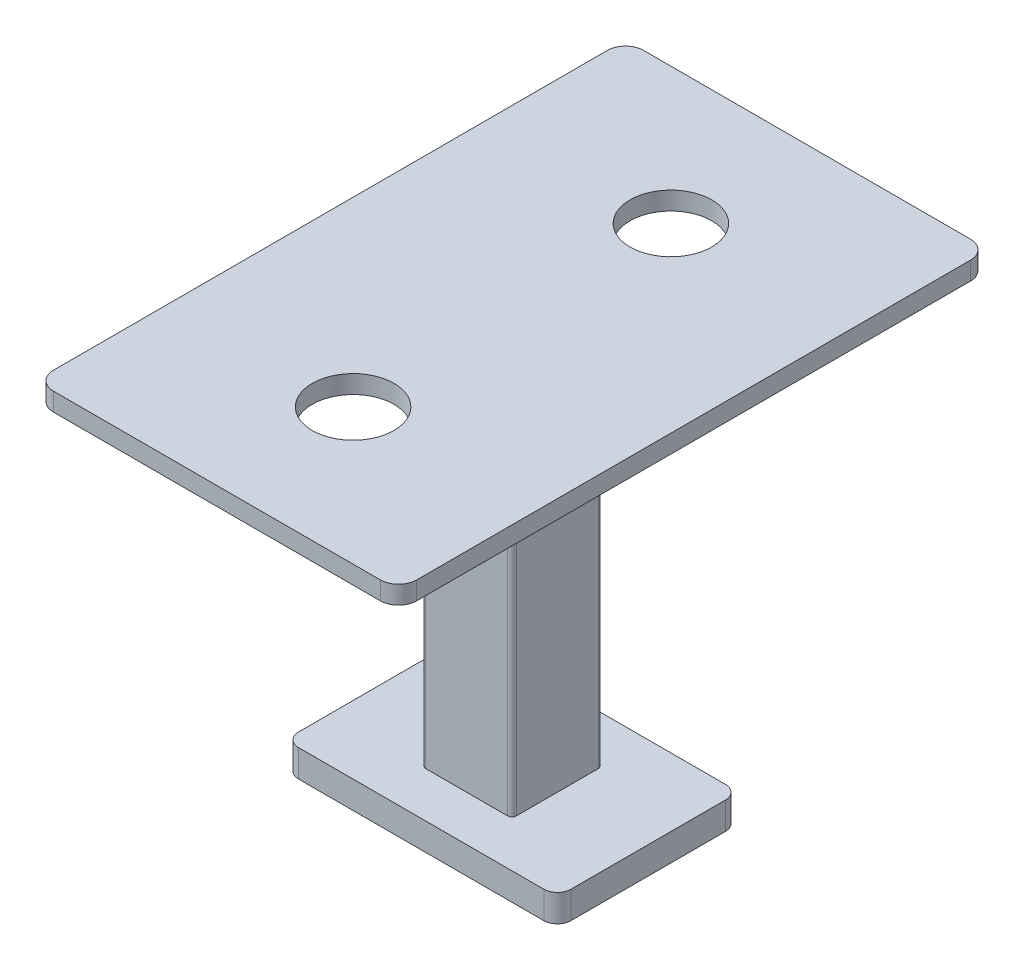
ISO-10303-21;
HEADER;
FILE_DESCRIPTION(('STEP AP214'),'2;1');
FILE_NAME('part.step','',(''),(''),'','','');
FILE_SCHEMA(('AUTOMOTIVE_DESIGN { 1 0 10303 214 1 1 1 1 }'));
ENDSEC;
DATA;
#1=APPLICATION_CONTEXT('core data for automotive mechanical design processes');
#2=APPLICATION_PROTOCOL_DEFINITION('international standard','automotive_design',2000,#1);
#3=PRODUCT_CONTEXT('',#1,'mechanical');
#4=PRODUCT('Part','Part','',(#3));
#5=PRODUCT_RELATED_PRODUCT_CATEGORY('part','',(#4));
#6=PRODUCT_DEFINITION_FORMATION('','',#4);
#7=PRODUCT_DEFINITION_CONTEXT('part definition',#1,'design');
#8=PRODUCT_DEFINITION('design','',#6,#7);
#9=PRODUCT_DEFINITION_SHAPE('','',#8);
#10=(LENGTH_UNIT() NAMED_UNIT(*) SI_UNIT(.MILLI.,.METRE.));
#11=(NAMED_UNIT(*) PLANE_ANGLE_UNIT() SI_UNIT($,.RADIAN.));
#12=(NAMED_UNIT(*) SI_UNIT($,.STERADIAN.) SOLID_ANGLE_UNIT());
#13=UNCERTAINTY_MEASURE_WITH_UNIT(LENGTH_MEASURE(1.E-05),#10,'distance_accuracy_value','');
#14=(GEOMETRIC_REPRESENTATION_CONTEXT(3) GLOBAL_UNCERTAINTY_ASSIGNED_CONTEXT((#13)) GLOBAL_UNIT_ASSIGNED_CONTEXT((#10,
#11,#12)) REPRESENTATION_CONTEXT('',''));
#15=CARTESIAN_POINT('',(0.,0.,0.));
#16=DIRECTION('',(0.,0.,1.));
#17=DIRECTION('',(1.,0.,0.));
#18=AXIS2_PLACEMENT_3D('',#15,#16,#17);
#19=CARTESIAN_POINT('',(28.5,3.,-18.5));
#20=DIRECTION('',(0.,1.,0.));
#21=DIRECTION('',(0.,0.,1.));
#22=AXIS2_PLACEMENT_3D('',#19,#20,#21);
#23=PLANE('',#22);
#24=CARTESIAN_POINT('',(28.5,3.,-18.5));
#25=DIRECTION('',(0.,1.,0.));
#26=DIRECTION('',(0.,0.,1.));
#27=AXIS2_PLACEMENT_3D('',#24,#25,#26);
#28=CIRCLE('',#27,1.5);
#29=CARTESIAN_POINT('',(30.,3.,-18.5));
#30=VERTEX_POINT('',#29);
#31=CARTESIAN_POINT('',(28.5,3.,-20.));
#32=VERTEX_POINT('',#31);
#33=EDGE_CURVE('E169',#30,#32,#28,.T.);
#34=ORIENTED_EDGE('',*,*,#33,.T.);
#35=DIRECTION('',(-1.,0.,0.));
#36=VECTOR('',#35,1.);
#37=CARTESIAN_POINT('',(28.5,3.,-20.));
#38=LINE('',#37,#36);
#39=CARTESIAN_POINT('',(1.50000000000001,3.,-20.));
#40=VERTEX_POINT('',#39);
#41=EDGE_CURVE('E108',#32,#40,#38,.T.);
#42=ORIENTED_EDGE('',*,*,#41,.T.);
#43=CARTESIAN_POINT('',(1.5,3.,-18.5));
#44=DIRECTION('',(0.,1.,0.));
#45=DIRECTION('',(0.,0.,1.));
#46=AXIS2_PLACEMENT_3D('',#43,#44,#45);
#47=CIRCLE('',#46,1.5);
#48=CARTESIAN_POINT('',(0.,3.,-18.5));
#49=VERTEX_POINT('',#48);
#50=EDGE_CURVE('E183',#40,#49,#47,.T.);
#51=ORIENTED_EDGE('',*,*,#50,.T.);
#52=DIRECTION('',(0.,0.,1.));
#53=VECTOR('',#52,1.);
#54=CARTESIAN_POINT('',(0.,3.,-18.5));
#55=LINE('',#54,#53);
#56=CARTESIAN_POINT('',(0.,3.,-1.50000000000001));
#57=VERTEX_POINT('',#56);
#58=EDGE_CURVE('E193',#49,#57,#55,.T.);
#59=ORIENTED_EDGE('',*,*,#58,.T.);
#60=CARTESIAN_POINT('',(1.5,3.,-1.5));
#61=DIRECTION('',(0.,-1.,0.));
#62=DIRECTION('',(0.,0.,-1.));
#63=AXIS2_PLACEMENT_3D('',#60,#61,#62);
#64=CIRCLE('',#63,1.5);
#65=CARTESIAN_POINT('',(1.50000000000001,3.,0.));
#66=VERTEX_POINT('',#65);
#67=EDGE_CURVE('E131',#66,#57,#64,.T.);
#68=ORIENTED_EDGE('',*,*,#67,.F.);
#69=DIRECTION('',(1.,0.,0.));
#70=VECTOR('',#69,1.);
#71=CARTESIAN_POINT('',(1.50000000000001,3.,0.));
#72=LINE('',#71,#70);
#73=CARTESIAN_POINT('',(28.5,3.,0.));
#74=VERTEX_POINT('',#73);
#75=EDGE_CURVE('E125',#66,#74,#72,.T.);
#76=ORIENTED_EDGE('',*,*,#75,.T.);
#77=CARTESIAN_POINT('',(28.5,3.,-1.5));
#78=DIRECTION('',(0.,-1.,0.));
#79=DIRECTION('',(0.,0.,-1.));
#80=AXIS2_PLACEMENT_3D('',#77,#78,#79);
#81=CIRCLE('',#80,1.5);
#82=CARTESIAN_POINT('',(30.,3.,-1.50000000000001));
#83=VERTEX_POINT('',#82);
#84=EDGE_CURVE('E129',#83,#74,#81,.T.);
#85=ORIENTED_EDGE('',*,*,#84,.F.);
#86=DIRECTION('',(0.,0.,-1.));
#87=VECTOR('',#86,1.);
#88=CARTESIAN_POINT('',(30.,3.,-1.50000000000001));
#89=LINE('',#88,#87);
#90=EDGE_CURVE('E67',#83,#30,#89,.T.);
#91=ORIENTED_EDGE('',*,*,#90,.T.);
#92=EDGE_LOOP('',(#34,#42,#51,#59,#68,#76,#85,#91));
#93=FACE_BOUND('',#92,.T.);
#94=DIRECTION('',(-1.,0.,0.));
#95=VECTOR('',#94,1.);
#96=CARTESIAN_POINT('',(10.5,3.,-15.));
#97=LINE('',#96,#95);
#98=CARTESIAN_POINT('',(19.5,3.,-15.));
#99=VERTEX_POINT('',#98);
#100=CARTESIAN_POINT('',(10.5,3.,-15.));
#101=VERTEX_POINT('',#100);
#102=EDGE_CURVE('E238',#99,#101,#97,.T.);
#103=ORIENTED_EDGE('',*,*,#102,.F.);
#104=CARTESIAN_POINT('',(19.5,3.,-14.5));
#105=DIRECTION('',(0.,1.,0.));
#106=DIRECTION('',(0.,0.,1.));
#107=AXIS2_PLACEMENT_3D('',#104,#105,#106);
#108=CIRCLE('',#107,0.5);
#109=CARTESIAN_POINT('',(20.,3.,-14.5));
#110=VERTEX_POINT('',#109);
#111=EDGE_CURVE('E241',#110,#99,#108,.T.);
#112=ORIENTED_EDGE('',*,*,#111,.F.);
#113=DIRECTION('',(0.,0.,-1.));
#114=VECTOR('',#113,1.);
#115=CARTESIAN_POINT('',(20.,3.,-5.50000000000001));
#116=LINE('',#115,#114);
#117=CARTESIAN_POINT('',(20.,3.,-5.50000000000001));
#118=VERTEX_POINT('',#117);
#119=EDGE_CURVE('E221',#118,#110,#116,.T.);
#120=ORIENTED_EDGE('',*,*,#119,.F.);
#121=CARTESIAN_POINT('',(19.5,3.,-5.50000000000001));
#122=DIRECTION('',(0.,1.,0.));
#123=DIRECTION('',(0.,0.,-1.));
#124=AXIS2_PLACEMENT_3D('',#121,#122,#123);
#125=CIRCLE('',#124,0.5);
#126=CARTESIAN_POINT('',(19.5,3.,-5.));
#127=VERTEX_POINT('',#126);
#128=EDGE_CURVE('E224',#127,#118,#125,.T.);
#129=ORIENTED_EDGE('',*,*,#128,.F.);
#130=DIRECTION('',(1.,0.,0.));
#131=VECTOR('',#130,1.);
#132=CARTESIAN_POINT('',(10.5,3.,-5.));
#133=LINE('',#132,#131);
#134=CARTESIAN_POINT('',(10.5,3.,-5.));
#135=VERTEX_POINT('',#134);
#136=EDGE_CURVE('E226',#135,#127,#133,.T.);
#137=ORIENTED_EDGE('',*,*,#136,.F.);
#138=CARTESIAN_POINT('',(10.5,3.,-5.5));
#139=DIRECTION('',(0.,1.,0.));
#140=DIRECTION('',(0.,0.,-1.));
#141=AXIS2_PLACEMENT_3D('',#138,#139,#140);
#142=CIRCLE('',#141,0.5);
#143=CARTESIAN_POINT('',(10.,3.,-5.50000000000001));
#144=VERTEX_POINT('',#143);
#145=EDGE_CURVE('E229',#144,#135,#142,.T.);
#146=ORIENTED_EDGE('',*,*,#145,.F.);
#147=DIRECTION('',(0.,0.,1.));
#148=VECTOR('',#147,1.);
#149=CARTESIAN_POINT('',(10.,3.,-5.50000000000001));
#150=LINE('',#149,#148);
#151=CARTESIAN_POINT('',(10.,3.,-14.5));
#152=VERTEX_POINT('',#151);
#153=EDGE_CURVE('E232',#152,#144,#150,.T.);
#154=ORIENTED_EDGE('',*,*,#153,.F.);
#155=CARTESIAN_POINT('',(10.5,3.,-14.5));
#156=DIRECTION('',(0.,1.,0.));
#157=DIRECTION('',(0.,0.,1.));
#158=AXIS2_PLACEMENT_3D('',#155,#156,#157);
#159=CIRCLE('',#158,0.5);
#160=EDGE_CURVE('E235',#101,#152,#159,.T.);
#161=ORIENTED_EDGE('',*,*,#160,.F.);
#162=EDGE_LOOP('',(#103,#112,#120,#129,#137,#146,#154,#161));
#163=FACE_BOUND('',#162,.T.);
#164=ADVANCED_FACE('F43',(#93,#163),#23,.T.);
#165=CARTESIAN_POINT('',(28.5,3.,-18.5));
#166=DIRECTION('',(0.,-1.,0.));
#167=DIRECTION('',(0.,0.,-1.));
#168=AXIS2_PLACEMENT_3D('',#165,#166,#167);
#169=CYLINDRICAL_SURFACE('',#168,1.5);
#170=CARTESIAN_POINT('',(28.5,0.,-18.5));
#171=DIRECTION('',(0.,1.,0.));
#172=DIRECTION('',(0.,0.,1.));
#173=AXIS2_PLACEMENT_3D('',#170,#171,#172);
#174=CIRCLE('',#173,1.5);
#175=CARTESIAN_POINT('',(30.,0.,-18.5));
#176=VERTEX_POINT('',#175);
#177=CARTESIAN_POINT('',(28.5,0.,-20.));
#178=VERTEX_POINT('',#177);
#179=EDGE_CURVE('E151',#176,#178,#174,.T.);
#180=ORIENTED_EDGE('',*,*,#179,.T.);
#181=DIRECTION('',(0.,-1.,0.));
#182=VECTOR('',#181,1.);
#183=CARTESIAN_POINT('',(28.5,3.,-20.));
#184=LINE('',#183,#182);
#185=EDGE_CURVE('E11',#32,#178,#184,.T.);
#186=ORIENTED_EDGE('',*,*,#185,.F.);
#187=ORIENTED_EDGE('',*,*,#33,.F.);
#188=DIRECTION('',(0.,-1.,0.));
#189=VECTOR('',#188,1.);
#190=CARTESIAN_POINT('',(30.,3.,-18.5));
#191=LINE('',#190,#189);
#192=EDGE_CURVE('E147',#30,#176,#191,.T.);
#193=ORIENTED_EDGE('',*,*,#192,.T.);
#194=EDGE_LOOP('',(#180,#186,#187,#193));
#195=FACE_BOUND('',#194,.T.);
#196=ADVANCED_FACE('F45',(#195),#169,.T.);
#197=CARTESIAN_POINT('',(28.5,3.,-20.));
#198=DIRECTION('',(0.,0.,1.));
#199=DIRECTION('',(1.,0.,0.));
#200=AXIS2_PLACEMENT_3D('',#197,#198,#199);
#201=PLANE('',#200);
#202=DIRECTION('',(-1.,0.,0.));
#203=VECTOR('',#202,1.);
#204=CARTESIAN_POINT('',(28.5,0.,-20.));
#205=LINE('',#204,#203);
#206=CARTESIAN_POINT('',(1.50000000000001,0.,-20.));
#207=VERTEX_POINT('',#206);
#208=EDGE_CURVE('E154',#178,#207,#205,.T.);
#209=ORIENTED_EDGE('',*,*,#208,.T.);
#210=DIRECTION('',(0.,-1.,0.));
#211=VECTOR('',#210,1.);
#212=CARTESIAN_POINT('',(1.50000000000001,3.,-20.));
#213=LINE('',#212,#211);
#214=EDGE_CURVE('E51',#40,#207,#213,.T.);
#215=ORIENTED_EDGE('',*,*,#214,.F.);
#216=ORIENTED_EDGE('',*,*,#41,.F.);
#217=ORIENTED_EDGE('',*,*,#185,.T.);
#218=EDGE_LOOP('',(#209,#215,#216,#217));
#219=FACE_BOUND('',#218,.T.);
#220=ADVANCED_FACE('F477',(#219),#201,.F.);
#221=CARTESIAN_POINT('',(1.5,3.,-18.5));
#222=DIRECTION('',(0.,-1.,0.));
#223=DIRECTION('',(0.,0.,-1.));
#224=AXIS2_PLACEMENT_3D('',#221,#222,#223);
#225=CYLINDRICAL_SURFACE('',#224,1.5);
#226=CARTESIAN_POINT('',(1.5,0.,-18.5));
#227=DIRECTION('',(0.,1.,0.));
#228=DIRECTION('',(0.,0.,1.));
#229=AXIS2_PLACEMENT_3D('',#226,#227,#228);
#230=CIRCLE('',#229,1.5);
#231=CARTESIAN_POINT('',(0.,0.,-18.5));
#232=VERTEX_POINT('',#231);
#233=EDGE_CURVE('E157',#207,#232,#230,.T.);
#234=ORIENTED_EDGE('',*,*,#233,.T.);
#235=DIRECTION('',(0.,-1.,0.));
#236=VECTOR('',#235,1.);
#237=CARTESIAN_POINT('',(0.,3.,-18.5));
#238=LINE('',#237,#236);
#239=EDGE_CURVE('E175',#49,#232,#238,.T.);
#240=ORIENTED_EDGE('',*,*,#239,.F.);
#241=ORIENTED_EDGE('',*,*,#50,.F.);
#242=ORIENTED_EDGE('',*,*,#214,.T.);
#243=EDGE_LOOP('',(#234,#240,#241,#242));
#244=FACE_BOUND('',#243,.T.);
#245=ADVANCED_FACE('F181',(#244),#225,.T.);
#246=CARTESIAN_POINT('',(0.,3.,-18.5));
#247=DIRECTION('',(1.,0.,0.));
#248=DIRECTION('',(0.,0.,-1.));
#249=AXIS2_PLACEMENT_3D('',#246,#247,#248);
#250=PLANE('',#249);
#251=DIRECTION('',(0.,0.,1.));
#252=VECTOR('',#251,1.);
#253=CARTESIAN_POINT('',(0.,0.,-18.5));
#254=LINE('',#253,#252);
#255=CARTESIAN_POINT('',(0.,0.,-1.50000000000001));
#256=VERTEX_POINT('',#255);
#257=EDGE_CURVE('E159',#232,#256,#254,.T.);
#258=ORIENTED_EDGE('',*,*,#257,.T.);
#259=DIRECTION('',(0.,-1.,0.));
#260=VECTOR('',#259,1.);
#261=CARTESIAN_POINT('',(0.,3.,-1.50000000000001));
#262=LINE('',#261,#260);
#263=EDGE_CURVE('E173',#57,#256,#262,.T.);
#264=ORIENTED_EDGE('',*,*,#263,.F.);
#265=ORIENTED_EDGE('',*,*,#58,.F.);
#266=ORIENTED_EDGE('',*,*,#239,.T.);
#267=EDGE_LOOP('',(#258,#264,#265,#266));
#268=FACE_BOUND('',#267,.T.);
#269=ADVANCED_FACE('F191',(#268),#250,.F.);
#270=CARTESIAN_POINT('',(1.5,3.,-1.5));
#271=DIRECTION('',(0.,-1.,0.));
#272=DIRECTION('',(0.,0.,-1.));
#273=AXIS2_PLACEMENT_3D('',#270,#271,#272);
#274=CYLINDRICAL_SURFACE('',#273,1.5);
#275=CARTESIAN_POINT('',(1.5,0.,-1.5));
#276=DIRECTION('',(0.,-1.,0.));
#277=DIRECTION('',(0.,0.,-1.));
#278=AXIS2_PLACEMENT_3D('',#275,#276,#277);
#279=CIRCLE('',#278,1.5);
#280=CARTESIAN_POINT('',(1.50000000000001,0.,0.));
#281=VERTEX_POINT('',#280);
#282=EDGE_CURVE('E162',#281,#256,#279,.T.);
#283=ORIENTED_EDGE('',*,*,#282,.F.);
#284=DIRECTION('',(0.,-1.,0.));
#285=VECTOR('',#284,1.);
#286=CARTESIAN_POINT('',(1.50000000000001,3.,0.));
#287=LINE('',#286,#285);
#288=EDGE_CURVE('E142',#66,#281,#287,.T.);
#289=ORIENTED_EDGE('',*,*,#288,.F.);
#290=ORIENTED_EDGE('',*,*,#67,.T.);
#291=ORIENTED_EDGE('',*,*,#263,.T.);
#292=EDGE_LOOP('',(#283,#289,#290,#291));
#293=FACE_BOUND('',#292,.T.);
#294=ADVANCED_FACE('F490',(#293),#274,.T.);
#295=CARTESIAN_POINT('',(1.50000000000001,3.,0.));
#296=DIRECTION('',(0.,0.,-1.));
#297=DIRECTION('',(-1.,0.,0.));
#298=AXIS2_PLACEMENT_3D('',#295,#296,#297);
#299=PLANE('',#298);
#300=DIRECTION('',(1.,0.,0.));
#301=VECTOR('',#300,1.);
#302=CARTESIAN_POINT('',(1.50000000000001,0.,0.));
#303=LINE('',#302,#301);
#304=CARTESIAN_POINT('',(28.5,0.,0.));
#305=VERTEX_POINT('',#304);
#306=EDGE_CURVE('E138',#281,#305,#303,.T.);
#307=ORIENTED_EDGE('',*,*,#306,.T.);
#308=DIRECTION('',(0.,-1.,0.));
#309=VECTOR('',#308,1.);
#310=CARTESIAN_POINT('',(28.5,3.,0.));
#311=LINE('',#310,#309);
#312=EDGE_CURVE('E135',#74,#305,#311,.T.);
#313=ORIENTED_EDGE('',*,*,#312,.F.);
#314=ORIENTED_EDGE('',*,*,#75,.F.);
#315=ORIENTED_EDGE('',*,*,#288,.T.);
#316=EDGE_LOOP('',(#307,#313,#314,#315));
#317=FACE_BOUND('',#316,.T.);
#318=ADVANCED_FACE('F136',(#317),#299,.F.);
#319=CARTESIAN_POINT('',(28.5,3.,-1.5));
#320=DIRECTION('',(0.,-1.,0.));
#321=DIRECTION('',(0.,0.,-1.));
#322=AXIS2_PLACEMENT_3D('',#319,#320,#321);
#323=CYLINDRICAL_SURFACE('',#322,1.5);
#324=CARTESIAN_POINT('',(28.5,0.,-1.5));
#325=DIRECTION('',(0.,-1.,0.));
#326=DIRECTION('',(0.,0.,-1.));
#327=AXIS2_PLACEMENT_3D('',#324,#325,#326);
#328=CIRCLE('',#327,1.5);
#329=CARTESIAN_POINT('',(30.,0.,-1.50000000000001));
#330=VERTEX_POINT('',#329);
#331=EDGE_CURVE('E166',#330,#305,#328,.T.);
#332=ORIENTED_EDGE('',*,*,#331,.F.);
#333=DIRECTION('',(0.,-1.,0.));
#334=VECTOR('',#333,1.);
#335=CARTESIAN_POINT('',(30.,3.,-1.50000000000001));
#336=LINE('',#335,#334);
#337=EDGE_CURVE('E143',#83,#330,#336,.T.);
#338=ORIENTED_EDGE('',*,*,#337,.F.);
#339=ORIENTED_EDGE('',*,*,#84,.T.);
#340=ORIENTED_EDGE('',*,*,#312,.T.);
#341=EDGE_LOOP('',(#332,#338,#339,#340));
#342=FACE_BOUND('',#341,.T.);
#343=ADVANCED_FACE('F145',(#342),#323,.T.);
#344=CARTESIAN_POINT('',(30.,3.,-1.50000000000001));
#345=DIRECTION('',(-1.,0.,0.));
#346=DIRECTION('',(0.,0.,1.));
#347=AXIS2_PLACEMENT_3D('',#344,#345,#346);
#348=PLANE('',#347);
#349=DIRECTION('',(0.,0.,-1.));
#350=VECTOR('',#349,1.);
#351=CARTESIAN_POINT('',(30.,0.,-1.50000000000001));
#352=LINE('',#351,#350);
#353=EDGE_CURVE('E100',#330,#176,#352,.T.);
#354=ORIENTED_EDGE('',*,*,#353,.T.);
#355=ORIENTED_EDGE('',*,*,#192,.F.);
#356=ORIENTED_EDGE('',*,*,#90,.F.);
#357=ORIENTED_EDGE('',*,*,#337,.T.);
#358=EDGE_LOOP('',(#354,#355,#356,#357));
#359=FACE_BOUND('',#358,.T.);
#360=ADVANCED_FACE('F483',(#359),#348,.F.);
#361=CARTESIAN_POINT('',(28.5,0.,-18.5));
#362=DIRECTION('',(0.,1.,0.));
#363=DIRECTION('',(0.,0.,1.));
#364=AXIS2_PLACEMENT_3D('',#361,#362,#363);
#365=PLANE('',#364);
#366=ORIENTED_EDGE('',*,*,#179,.F.);
#367=ORIENTED_EDGE('',*,*,#353,.F.);
#368=ORIENTED_EDGE('',*,*,#331,.T.);
#369=ORIENTED_EDGE('',*,*,#306,.F.);
#370=ORIENTED_EDGE('',*,*,#282,.T.);
#371=ORIENTED_EDGE('',*,*,#257,.F.);
#372=ORIENTED_EDGE('',*,*,#233,.F.);
#373=ORIENTED_EDGE('',*,*,#208,.F.);
#374=EDGE_LOOP('',(#366,#367,#368,#369,#370,#371,#372,#373));
#375=FACE_BOUND('',#374,.T.);
#376=ADVANCED_FACE('F187',(#375),#365,.F.);
#377=CARTESIAN_POINT('',(19.5,44.,-14.5));
#378=DIRECTION('',(0.,-1.,0.));
#379=DIRECTION('',(0.,0.,-1.));
#380=AXIS2_PLACEMENT_3D('',#377,#378,#379);
#381=CYLINDRICAL_SURFACE('',#380,0.5);
#382=ORIENTED_EDGE('',*,*,#111,.T.);
#383=DIRECTION('',(0.,-1.,0.));
#384=VECTOR('',#383,1.);
#385=CARTESIAN_POINT('',(19.5,44.,-15.));
#386=LINE('',#385,#384);
#387=CARTESIAN_POINT('',(19.5,44.,-15.));
#388=VERTEX_POINT('',#387);
#389=EDGE_CURVE('E155',#388,#99,#386,.T.);
#390=ORIENTED_EDGE('',*,*,#389,.F.);
#391=CARTESIAN_POINT('',(19.5,44.,-14.5));
#392=DIRECTION('',(0.,1.,0.));
#393=DIRECTION('',(0.,0.,1.));
#394=AXIS2_PLACEMENT_3D('',#391,#392,#393);
#395=CIRCLE('',#394,0.5);
#396=CARTESIAN_POINT('',(20.,44.,-14.5));
#397=VERTEX_POINT('',#396);
#398=EDGE_CURVE('E223',#397,#388,#395,.T.);
#399=ORIENTED_EDGE('',*,*,#398,.F.);
#400=DIRECTION('',(0.,-1.,0.));
#401=VECTOR('',#400,1.);
#402=CARTESIAN_POINT('',(20.,44.,-14.5));
#403=LINE('',#402,#401);
#404=EDGE_CURVE('E217',#397,#110,#403,.T.);
#405=ORIENTED_EDGE('',*,*,#404,.T.);
#406=EDGE_LOOP('',(#382,#390,#399,#405));
#407=FACE_BOUND('',#406,.T.);
#408=ADVANCED_FACE('F439',(#407),#381,.T.);
#409=CARTESIAN_POINT('',(10.5,44.,-15.));
#410=DIRECTION('',(0.,0.,1.));
#411=DIRECTION('',(1.,0.,0.));
#412=AXIS2_PLACEMENT_3D('',#409,#410,#411);
#413=PLANE('',#412);
#414=ORIENTED_EDGE('',*,*,#102,.T.);
#415=DIRECTION('',(0.,-1.,0.));
#416=VECTOR('',#415,1.);
#417=CARTESIAN_POINT('',(10.5,44.,-15.));
#418=LINE('',#417,#416);
#419=CARTESIAN_POINT('',(10.5,44.,-15.));
#420=VERTEX_POINT('',#419);
#421=EDGE_CURVE('E201',#420,#101,#418,.T.);
#422=ORIENTED_EDGE('',*,*,#421,.F.);
#423=DIRECTION('',(-1.,0.,0.));
#424=VECTOR('',#423,1.);
#425=CARTESIAN_POINT('',(10.5,44.,-15.));
#426=LINE('',#425,#424);
#427=EDGE_CURVE('E262',#388,#420,#426,.T.);
#428=ORIENTED_EDGE('',*,*,#427,.F.);
#429=ORIENTED_EDGE('',*,*,#389,.T.);
#430=EDGE_LOOP('',(#414,#422,#428,#429));
#431=FACE_BOUND('',#430,.T.);
#432=ADVANCED_FACE('F445',(#431),#413,.F.);
#433=CARTESIAN_POINT('',(10.5,44.,-14.5));
#434=DIRECTION('',(0.,-1.,0.));
#435=DIRECTION('',(0.,0.,-1.));
#436=AXIS2_PLACEMENT_3D('',#433,#434,#435);
#437=CYLINDRICAL_SURFACE('',#436,0.5);
#438=ORIENTED_EDGE('',*,*,#160,.T.);
#439=DIRECTION('',(0.,-1.,0.));
#440=VECTOR('',#439,1.);
#441=CARTESIAN_POINT('',(10.,44.,-14.5));
#442=LINE('',#441,#440);
#443=CARTESIAN_POINT('',(10.,44.,-14.5));
#444=VERTEX_POINT('',#443);
#445=EDGE_CURVE('E204',#444,#152,#442,.T.);
#446=ORIENTED_EDGE('',*,*,#445,.F.);
#447=CARTESIAN_POINT('',(10.5,44.,-14.5));
#448=DIRECTION('',(0.,1.,0.));
#449=DIRECTION('',(0.,0.,1.));
#450=AXIS2_PLACEMENT_3D('',#447,#448,#449);
#451=CIRCLE('',#450,0.5);
#452=EDGE_CURVE('E259',#420,#444,#451,.T.);
#453=ORIENTED_EDGE('',*,*,#452,.F.);
#454=ORIENTED_EDGE('',*,*,#421,.T.);
#455=EDGE_LOOP('',(#438,#446,#453,#454));
#456=FACE_BOUND('',#455,.T.);
#457=ADVANCED_FACE('F448',(#456),#437,.T.);
#458=CARTESIAN_POINT('',(10.,44.,-5.50000000000001));
#459=DIRECTION('',(1.,0.,0.));
#460=DIRECTION('',(0.,0.,-1.));
#461=AXIS2_PLACEMENT_3D('',#458,#459,#460);
#462=PLANE('',#461);
#463=ORIENTED_EDGE('',*,*,#153,.T.);
#464=DIRECTION('',(0.,-1.,0.));
#465=VECTOR('',#464,1.);
#466=CARTESIAN_POINT('',(10.,44.,-5.50000000000001));
#467=LINE('',#466,#465);
#468=CARTESIAN_POINT('',(10.,44.,-5.50000000000001));
#469=VERTEX_POINT('',#468);
#470=EDGE_CURVE('E207',#469,#144,#467,.T.);
#471=ORIENTED_EDGE('',*,*,#470,.F.);
#472=DIRECTION('',(0.,0.,1.));
#473=VECTOR('',#472,1.);
#474=CARTESIAN_POINT('',(10.,44.,-5.50000000000001));
#475=LINE('',#474,#473);
#476=EDGE_CURVE('E256',#444,#469,#475,.T.);
#477=ORIENTED_EDGE('',*,*,#476,.F.);
#478=ORIENTED_EDGE('',*,*,#445,.T.);
#479=EDGE_LOOP('',(#463,#471,#477,#478));
#480=FACE_BOUND('',#479,.T.);
#481=ADVANCED_FACE('F461',(#480),#462,.F.);
#482=CARTESIAN_POINT('',(10.5,44.,-5.5));
#483=DIRECTION('',(0.,-1.,0.));
#484=DIRECTION('',(0.,0.,-1.));
#485=AXIS2_PLACEMENT_3D('',#482,#483,#484);
#486=CYLINDRICAL_SURFACE('',#485,0.5);
#487=ORIENTED_EDGE('',*,*,#145,.T.);
#488=DIRECTION('',(0.,-1.,0.));
#489=VECTOR('',#488,1.);
#490=CARTESIAN_POINT('',(10.5,44.,-5.));
#491=LINE('',#490,#489);
#492=CARTESIAN_POINT('',(10.5,44.,-5.));
#493=VERTEX_POINT('',#492);
#494=EDGE_CURVE('E210',#493,#135,#491,.T.);
#495=ORIENTED_EDGE('',*,*,#494,.F.);
#496=CARTESIAN_POINT('',(10.5,44.,-5.5));
#497=DIRECTION('',(0.,1.,0.));
#498=DIRECTION('',(0.,0.,-1.));
#499=AXIS2_PLACEMENT_3D('',#496,#497,#498);
#500=CIRCLE('',#499,0.5);
#501=EDGE_CURVE('E253',#469,#493,#500,.T.);
#502=ORIENTED_EDGE('',*,*,#501,.F.);
#503=ORIENTED_EDGE('',*,*,#470,.T.);
#504=EDGE_LOOP('',(#487,#495,#502,#503));
#505=FACE_BOUND('',#504,.T.);
#506=ADVANCED_FACE('F457',(#505),#486,.T.);
#507=CARTESIAN_POINT('',(10.5,44.,-5.));
#508=DIRECTION('',(0.,0.,-1.));
#509=DIRECTION('',(-1.,0.,0.));
#510=AXIS2_PLACEMENT_3D('',#507,#508,#509);
#511=PLANE('',#510);
#512=ORIENTED_EDGE('',*,*,#136,.T.);
#513=DIRECTION('',(0.,-1.,0.));
#514=VECTOR('',#513,1.);
#515=CARTESIAN_POINT('',(19.5,44.,-5.));
#516=LINE('',#515,#514);
#517=CARTESIAN_POINT('',(19.5,44.,-5.));
#518=VERTEX_POINT('',#517);
#519=EDGE_CURVE('E213',#518,#127,#516,.T.);
#520=ORIENTED_EDGE('',*,*,#519,.F.);
#521=DIRECTION('',(1.,0.,0.));
#522=VECTOR('',#521,1.);
#523=CARTESIAN_POINT('',(10.5,44.,-5.));
#524=LINE('',#523,#522);
#525=EDGE_CURVE('E250',#493,#518,#524,.T.);
#526=ORIENTED_EDGE('',*,*,#525,.F.);
#527=ORIENTED_EDGE('',*,*,#494,.T.);
#528=EDGE_LOOP('',(#512,#520,#526,#527));
#529=FACE_BOUND('',#528,.T.);
#530=ADVANCED_FACE('F459',(#529),#511,.F.);
#531=CARTESIAN_POINT('',(19.5,44.,-5.50000000000001));
#532=DIRECTION('',(0.,-1.,0.));
#533=DIRECTION('',(0.,0.,-1.));
#534=AXIS2_PLACEMENT_3D('',#531,#532,#533);
#535=CYLINDRICAL_SURFACE('',#534,0.5);
#536=ORIENTED_EDGE('',*,*,#128,.T.);
#537=DIRECTION('',(0.,-1.,0.));
#538=VECTOR('',#537,1.);
#539=CARTESIAN_POINT('',(20.,44.,-5.50000000000001));
#540=LINE('',#539,#538);
#541=CARTESIAN_POINT('',(20.,44.,-5.50000000000001));
#542=VERTEX_POINT('',#541);
#543=EDGE_CURVE('E58',#542,#118,#540,.T.);
#544=ORIENTED_EDGE('',*,*,#543,.F.);
#545=CARTESIAN_POINT('',(19.5,44.,-5.50000000000001));
#546=DIRECTION('',(0.,1.,0.));
#547=DIRECTION('',(0.,0.,-1.));
#548=AXIS2_PLACEMENT_3D('',#545,#546,#547);
#549=CIRCLE('',#548,0.5);
#550=EDGE_CURVE('E247',#518,#542,#549,.T.);
#551=ORIENTED_EDGE('',*,*,#550,.F.);
#552=ORIENTED_EDGE('',*,*,#519,.T.);
#553=EDGE_LOOP('',(#536,#544,#551,#552));
#554=FACE_BOUND('',#553,.T.);
#555=ADVANCED_FACE('F454',(#554),#535,.T.);
#556=CARTESIAN_POINT('',(20.,44.,-5.50000000000001));
#557=DIRECTION('',(-1.,0.,0.));
#558=DIRECTION('',(0.,0.,1.));
#559=AXIS2_PLACEMENT_3D('',#556,#557,#558);
#560=PLANE('',#559);
#561=ORIENTED_EDGE('',*,*,#119,.T.);
#562=ORIENTED_EDGE('',*,*,#404,.F.);
#563=DIRECTION('',(0.,0.,-1.));
#564=VECTOR('',#563,1.);
#565=CARTESIAN_POINT('',(20.,44.,-5.50000000000001));
#566=LINE('',#565,#564);
#567=EDGE_CURVE('E220',#542,#397,#566,.T.);
#568=ORIENTED_EDGE('',*,*,#567,.F.);
#569=ORIENTED_EDGE('',*,*,#543,.T.);
#570=EDGE_LOOP('',(#561,#562,#568,#569));
#571=FACE_BOUND('',#570,.T.);
#572=ADVANCED_FACE('F435',(#571),#560,.F.);
#573=CARTESIAN_POINT('',(-3.,46.,20.5));
#574=DIRECTION('',(0.,-1.,0.));
#575=DIRECTION('',(0.,0.,-1.));
#576=AXIS2_PLACEMENT_3D('',#573,#574,#575);
#577=CYLINDRICAL_SURFACE('',#576,2.);
#578=CARTESIAN_POINT('',(-3.,44.,20.5));
#579=DIRECTION('',(0.,1.,0.));
#580=DIRECTION('',(0.,0.,-1.));
#581=AXIS2_PLACEMENT_3D('',#578,#579,#580);
#582=CIRCLE('',#581,2.);
#583=CARTESIAN_POINT('',(-5.,44.,20.5));
#584=VERTEX_POINT('',#583);
#585=CARTESIAN_POINT('',(-3.,44.,22.5));
#586=VERTEX_POINT('',#585);
#587=EDGE_CURVE('E313',#584,#586,#582,.T.);
#588=ORIENTED_EDGE('',*,*,#587,.T.);
#589=DIRECTION('',(0.,-1.,0.));
#590=VECTOR('',#589,1.);
#591=CARTESIAN_POINT('',(-3.,46.,22.5));
#592=LINE('',#591,#590);
#593=CARTESIAN_POINT('',(-3.,46.,22.5));
#594=VERTEX_POINT('',#593);
#595=EDGE_CURVE('E244',#594,#586,#592,.T.);
#596=ORIENTED_EDGE('',*,*,#595,.F.);
#597=CARTESIAN_POINT('',(-3.,46.,20.5));
#598=DIRECTION('',(0.,1.,0.));
#599=DIRECTION('',(0.,0.,-1.));
#600=AXIS2_PLACEMENT_3D('',#597,#598,#599);
#601=CIRCLE('',#600,2.);
#602=CARTESIAN_POINT('',(-5.,46.,20.5));
#603=VERTEX_POINT('',#602);
#604=EDGE_CURVE('E294',#603,#594,#601,.T.);
#605=ORIENTED_EDGE('',*,*,#604,.F.);
#606=DIRECTION('',(0.,-1.,0.));
#607=VECTOR('',#606,1.);
#608=CARTESIAN_POINT('',(-5.,46.,20.5));
#609=LINE('',#608,#607);
#610=EDGE_CURVE('E287',#603,#584,#609,.T.);
#611=ORIENTED_EDGE('',*,*,#610,.T.);
#612=EDGE_LOOP('',(#588,#596,#605,#611));
#613=FACE_BOUND('',#612,.T.);
#614=ADVANCED_FACE('F374',(#613),#577,.T.);
#615=CARTESIAN_POINT('',(33.,46.,22.5));
#616=DIRECTION('',(0.,0.,-1.));
#617=DIRECTION('',(-1.,0.,0.));
#618=AXIS2_PLACEMENT_3D('',#615,#616,#617);
#619=PLANE('',#618);
#620=DIRECTION('',(1.,0.,0.));
#621=VECTOR('',#620,1.);
#622=CARTESIAN_POINT('',(33.,44.,22.5));
#623=LINE('',#622,#621);
#624=CARTESIAN_POINT('',(33.,44.,22.5));
#625=VERTEX_POINT('',#624);
#626=EDGE_CURVE('E310',#586,#625,#623,.T.);
#627=ORIENTED_EDGE('',*,*,#626,.T.);
#628=DIRECTION('',(0.,-1.,0.));
#629=VECTOR('',#628,1.);
#630=CARTESIAN_POINT('',(33.,46.,22.5));
#631=LINE('',#630,#629);
#632=CARTESIAN_POINT('',(33.,46.,22.5));
#633=VERTEX_POINT('',#632);
#634=EDGE_CURVE('E269',#633,#625,#631,.T.);
#635=ORIENTED_EDGE('',*,*,#634,.F.);
#636=DIRECTION('',(1.,0.,0.));
#637=VECTOR('',#636,1.);
#638=CARTESIAN_POINT('',(33.,46.,22.5));
#639=LINE('',#638,#637);
#640=EDGE_CURVE('E334',#594,#633,#639,.T.);
#641=ORIENTED_EDGE('',*,*,#640,.F.);
#642=ORIENTED_EDGE('',*,*,#595,.T.);
#643=EDGE_LOOP('',(#627,#635,#641,#642));
#644=FACE_BOUND('',#643,.T.);
#645=ADVANCED_FACE('F378',(#644),#619,.F.);
#646=CARTESIAN_POINT('',(33.,46.,20.5));
#647=DIRECTION('',(0.,-1.,0.));
#648=DIRECTION('',(0.,0.,-1.));
#649=AXIS2_PLACEMENT_3D('',#646,#647,#648);
#650=CYLINDRICAL_SURFACE('',#649,2.00000000000001);
#651=CARTESIAN_POINT('',(33.,44.,20.5));
#652=DIRECTION('',(0.,1.,0.));
#653=DIRECTION('',(0.,0.,1.));
#654=AXIS2_PLACEMENT_3D('',#651,#652,#653);
#655=CIRCLE('',#654,2.00000000000001);
#656=CARTESIAN_POINT('',(35.,44.,20.5));
#657=VERTEX_POINT('',#656);
#658=EDGE_CURVE('E307',#625,#657,#655,.T.);
#659=ORIENTED_EDGE('',*,*,#658,.T.);
#660=DIRECTION('',(0.,-1.,0.));
#661=VECTOR('',#660,1.);
#662=CARTESIAN_POINT('',(35.,46.,20.5));
#663=LINE('',#662,#661);
#664=CARTESIAN_POINT('',(35.,46.,20.5));
#665=VERTEX_POINT('',#664);
#666=EDGE_CURVE('E272',#665,#657,#663,.T.);
#667=ORIENTED_EDGE('',*,*,#666,.F.);
#668=CARTESIAN_POINT('',(33.,46.,20.5));
#669=DIRECTION('',(0.,1.,0.));
#670=DIRECTION('',(0.,0.,1.));
#671=AXIS2_PLACEMENT_3D('',#668,#669,#670);
#672=CIRCLE('',#671,2.00000000000001);
#673=EDGE_CURVE('E331',#633,#665,#672,.T.);
#674=ORIENTED_EDGE('',*,*,#673,.F.);
#675=ORIENTED_EDGE('',*,*,#634,.T.);
#676=EDGE_LOOP('',(#659,#667,#674,#675));
#677=FACE_BOUND('',#676,.T.);
#678=ADVANCED_FACE('F614',(#677),#650,.T.);
#679=CARTESIAN_POINT('',(35.,46.,20.5));
#680=DIRECTION('',(-1.,0.,0.));
#681=DIRECTION('',(0.,0.,1.));
#682=AXIS2_PLACEMENT_3D('',#679,#680,#681);
#683=PLANE('',#682);
#684=DIRECTION('',(0.,0.,-1.));
#685=VECTOR('',#684,1.);
#686=CARTESIAN_POINT('',(35.,44.,20.5));
#687=LINE('',#686,#685);
#688=CARTESIAN_POINT('',(35.,44.,-40.5));
#689=VERTEX_POINT('',#688);
#690=EDGE_CURVE('E304',#657,#689,#687,.T.);
#691=ORIENTED_EDGE('',*,*,#690,.T.);
#692=DIRECTION('',(0.,-1.,0.));
#693=VECTOR('',#692,1.);
#694=CARTESIAN_POINT('',(35.,46.,-40.5));
#695=LINE('',#694,#693);
#696=CARTESIAN_POINT('',(35.,46.,-40.5));
#697=VERTEX_POINT('',#696);
#698=EDGE_CURVE('E275',#697,#689,#695,.T.);
#699=ORIENTED_EDGE('',*,*,#698,.F.);
#700=DIRECTION('',(0.,0.,-1.));
#701=VECTOR('',#700,1.);
#702=CARTESIAN_POINT('',(35.,46.,20.5));
#703=LINE('',#702,#701);
#704=EDGE_CURVE('E328',#665,#697,#703,.T.);
#705=ORIENTED_EDGE('',*,*,#704,.F.);
#706=ORIENTED_EDGE('',*,*,#666,.T.);
#707=EDGE_LOOP('',(#691,#699,#705,#706));
#708=FACE_BOUND('',#707,.T.);
#709=ADVANCED_FACE('F623',(#708),#683,.F.);
#710=CARTESIAN_POINT('',(33.,46.,-40.5));
#711=DIRECTION('',(0.,-1.,0.));
#712=DIRECTION('',(0.,0.,-1.));
#713=AXIS2_PLACEMENT_3D('',#710,#711,#712);
#714=CYLINDRICAL_SURFACE('',#713,2.00000000000001);
#715=CARTESIAN_POINT('',(33.,44.,-40.5));
#716=DIRECTION('',(0.,1.,0.));
#717=DIRECTION('',(0.,0.,1.));
#718=AXIS2_PLACEMENT_3D('',#715,#716,#717);
#719=CIRCLE('',#718,2.00000000000001);
#720=CARTESIAN_POINT('',(33.,44.,-42.5));
#721=VERTEX_POINT('',#720);
#722=EDGE_CURVE('E301',#689,#721,#719,.T.);
#723=ORIENTED_EDGE('',*,*,#722,.T.);
#724=DIRECTION('',(0.,-1.,0.));
#725=VECTOR('',#724,1.);
#726=CARTESIAN_POINT('',(33.,46.,-42.5));
#727=LINE('',#726,#725);
#728=CARTESIAN_POINT('',(33.,46.,-42.5));
#729=VERTEX_POINT('',#728);
#730=EDGE_CURVE('E278',#729,#721,#727,.T.);
#731=ORIENTED_EDGE('',*,*,#730,.F.);
#732=CARTESIAN_POINT('',(33.,46.,-40.5));
#733=DIRECTION('',(0.,1.,0.));
#734=DIRECTION('',(0.,0.,1.));
#735=AXIS2_PLACEMENT_3D('',#732,#733,#734);
#736=CIRCLE('',#735,2.00000000000001);
#737=EDGE_CURVE('E325',#697,#729,#736,.T.);
#738=ORIENTED_EDGE('',*,*,#737,.F.);
#739=ORIENTED_EDGE('',*,*,#698,.T.);
#740=EDGE_LOOP('',(#723,#731,#738,#739));
#741=FACE_BOUND('',#740,.T.);
#742=ADVANCED_FACE('F633',(#741),#714,.T.);
#743=CARTESIAN_POINT('',(33.,46.,-42.5));
#744=DIRECTION('',(0.,0.,1.));
#745=DIRECTION('',(1.,0.,0.));
#746=AXIS2_PLACEMENT_3D('',#743,#744,#745);
#747=PLANE('',#746);
#748=DIRECTION('',(-1.,0.,0.));
#749=VECTOR('',#748,1.);
#750=CARTESIAN_POINT('',(33.,44.,-42.5));
#751=LINE('',#750,#749);
#752=CARTESIAN_POINT('',(-3.,44.,-42.5));
#753=VERTEX_POINT('',#752);
#754=EDGE_CURVE('E298',#721,#753,#751,.T.);
#755=ORIENTED_EDGE('',*,*,#754,.T.);
#756=DIRECTION('',(0.,-1.,0.));
#757=VECTOR('',#756,1.);
#758=CARTESIAN_POINT('',(-3.,46.,-42.5));
#759=LINE('',#758,#757);
#760=CARTESIAN_POINT('',(-3.,46.,-42.5));
#761=VERTEX_POINT('',#760);
#762=EDGE_CURVE('E281',#761,#753,#759,.T.);
#763=ORIENTED_EDGE('',*,*,#762,.F.);
#764=DIRECTION('',(-1.,0.,0.));
#765=VECTOR('',#764,1.);
#766=CARTESIAN_POINT('',(33.,46.,-42.5));
#767=LINE('',#766,#765);
#768=EDGE_CURVE('E322',#729,#761,#767,.T.);
#769=ORIENTED_EDGE('',*,*,#768,.F.);
#770=ORIENTED_EDGE('',*,*,#730,.T.);
#771=EDGE_LOOP('',(#755,#763,#769,#770));
#772=FACE_BOUND('',#771,.T.);
#773=ADVANCED_FACE('F643',(#772),#747,.F.);
#774=CARTESIAN_POINT('',(-3.,46.,-40.5));
#775=DIRECTION('',(0.,-1.,0.));
#776=DIRECTION('',(0.,0.,-1.));
#777=AXIS2_PLACEMENT_3D('',#774,#775,#776);
#778=CYLINDRICAL_SURFACE('',#777,1.99999999999999);
#779=CARTESIAN_POINT('',(-3.,44.,-40.5));
#780=DIRECTION('',(0.,1.,0.));
#781=DIRECTION('',(0.,0.,1.));
#782=AXIS2_PLACEMENT_3D('',#779,#780,#781);
#783=CIRCLE('',#782,1.99999999999999);
#784=CARTESIAN_POINT('',(-4.99999999999999,44.,-40.5));
#785=VERTEX_POINT('',#784);
#786=EDGE_CURVE('E295',#753,#785,#783,.T.);
#787=ORIENTED_EDGE('',*,*,#786,.T.);
#788=DIRECTION('',(0.,-1.,0.));
#789=VECTOR('',#788,1.);
#790=CARTESIAN_POINT('',(-4.99999999999999,46.,-40.5));
#791=LINE('',#790,#789);
#792=CARTESIAN_POINT('',(-4.99999999999999,46.,-40.5));
#793=VERTEX_POINT('',#792);
#794=EDGE_CURVE('E284',#793,#785,#791,.T.);
#795=ORIENTED_EDGE('',*,*,#794,.F.);
#796=CARTESIAN_POINT('',(-3.,46.,-40.5));
#797=DIRECTION('',(0.,1.,0.));
#798=DIRECTION('',(0.,0.,1.));
#799=AXIS2_PLACEMENT_3D('',#796,#797,#798);
#800=CIRCLE('',#799,1.99999999999999);
#801=EDGE_CURVE('E319',#761,#793,#800,.T.);
#802=ORIENTED_EDGE('',*,*,#801,.F.);
#803=ORIENTED_EDGE('',*,*,#762,.T.);
#804=EDGE_LOOP('',(#787,#795,#802,#803));
#805=FACE_BOUND('',#804,.T.);
#806=ADVANCED_FACE('F653',(#805),#778,.T.);
#807=CARTESIAN_POINT('',(-5.,46.,20.5));
#808=DIRECTION('',(1.,0.,0.));
#809=DIRECTION('',(0.,0.,-1.));
#810=AXIS2_PLACEMENT_3D('',#807,#808,#809);
#811=PLANE('',#810);
#812=DIRECTION('',(0.,0.,1.));
#813=VECTOR('',#812,1.);
#814=CARTESIAN_POINT('',(-5.,44.,20.5));
#815=LINE('',#814,#813);
#816=EDGE_CURVE('E291',#785,#584,#815,.T.);
#817=ORIENTED_EDGE('',*,*,#816,.T.);
#818=ORIENTED_EDGE('',*,*,#610,.F.);
#819=DIRECTION('',(0.,0.,1.));
#820=VECTOR('',#819,1.);
#821=CARTESIAN_POINT('',(-5.,46.,20.5));
#822=LINE('',#821,#820);
#823=EDGE_CURVE('E290',#793,#603,#822,.T.);
#824=ORIENTED_EDGE('',*,*,#823,.F.);
#825=ORIENTED_EDGE('',*,*,#794,.T.);
#826=EDGE_LOOP('',(#817,#818,#824,#825));
#827=FACE_BOUND('',#826,.T.);
#828=ADVANCED_FACE('F358',(#827),#811,.F.);
#829=CARTESIAN_POINT('',(-3.,46.,20.5));
#830=DIRECTION('',(0.,-1.,0.));
#831=DIRECTION('',(0.,0.,-1.));
#832=AXIS2_PLACEMENT_3D('',#829,#830,#831);
#833=PLANE('',#832);
#834=CARTESIAN_POINT('',(15.,46.,-27.5));
#835=DIRECTION('',(0.,1.,0.));
#836=DIRECTION('',(0.,0.,1.));
#837=AXIS2_PLACEMENT_3D('',#834,#835,#836);
#838=CIRCLE('',#837,4.50000000000001);
#839=CARTESIAN_POINT('',(15.,46.,-23.));
#840=VERTEX_POINT('',#839);
#841=EDGE_CURVE('E342',#840,#840,#838,.T.);
#842=ORIENTED_EDGE('',*,*,#841,.F.);
#843=EDGE_LOOP('',(#842));
#844=FACE_BOUND('',#843,.T.);
#845=CARTESIAN_POINT('',(15.,46.,7.49999999999999));
#846=DIRECTION('',(0.,1.,0.));
#847=DIRECTION('',(0.,0.,1.));
#848=AXIS2_PLACEMENT_3D('',#845,#846,#847);
#849=CIRCLE('',#848,4.5);
#850=CARTESIAN_POINT('',(15.,46.,12.));
#851=VERTEX_POINT('',#850);
#852=EDGE_CURVE('E339',#851,#851,#849,.T.);
#853=ORIENTED_EDGE('',*,*,#852,.F.);
#854=EDGE_LOOP('',(#853));
#855=FACE_BOUND('',#854,.T.);
#856=ORIENTED_EDGE('',*,*,#604,.T.);
#857=ORIENTED_EDGE('',*,*,#640,.T.);
#858=ORIENTED_EDGE('',*,*,#673,.T.);
#859=ORIENTED_EDGE('',*,*,#704,.T.);
#860=ORIENTED_EDGE('',*,*,#737,.T.);
#861=ORIENTED_EDGE('',*,*,#768,.T.);
#862=ORIENTED_EDGE('',*,*,#801,.T.);
#863=ORIENTED_EDGE('',*,*,#823,.T.);
#864=EDGE_LOOP('',(#856,#857,#858,#859,#860,#861,#862,#863));
#865=FACE_BOUND('',#864,.T.);
#866=ADVANCED_FACE('F354',(#844,#855,#865),#833,.F.);
#867=CARTESIAN_POINT('',(-3.,44.,20.5));
#868=DIRECTION('',(0.,-1.,0.));
#869=DIRECTION('',(0.,0.,-1.));
#870=AXIS2_PLACEMENT_3D('',#867,#868,#869);
#871=PLANE('',#870);
#872=CARTESIAN_POINT('',(15.,44.,-27.5));
#873=DIRECTION('',(0.,-1.,0.));
#874=DIRECTION('',(0.,0.,-1.));
#875=AXIS2_PLACEMENT_3D('',#872,#873,#874);
#876=CIRCLE('',#875,4.50000000000001);
#877=CARTESIAN_POINT('',(15.,44.,-32.));
#878=VERTEX_POINT('',#877);
#879=EDGE_CURVE('E316',#878,#878,#876,.F.);
#880=ORIENTED_EDGE('',*,*,#879,.T.);
#881=EDGE_LOOP('',(#880));
#882=FACE_BOUND('',#881,.T.);
#883=CARTESIAN_POINT('',(15.,44.,7.49999999999999));
#884=DIRECTION('',(0.,-1.,0.));
#885=DIRECTION('',(0.,0.,-1.));
#886=AXIS2_PLACEMENT_3D('',#883,#884,#885);
#887=CIRCLE('',#886,4.5);
#888=CARTESIAN_POINT('',(15.,44.,2.99999999999999));
#889=VERTEX_POINT('',#888);
#890=EDGE_CURVE('E343',#889,#889,#887,.F.);
#891=ORIENTED_EDGE('',*,*,#890,.T.);
#892=EDGE_LOOP('',(#891));
#893=FACE_BOUND('',#892,.T.);
#894=ORIENTED_EDGE('',*,*,#567,.T.);
#895=ORIENTED_EDGE('',*,*,#398,.T.);
#896=ORIENTED_EDGE('',*,*,#427,.T.);
#897=ORIENTED_EDGE('',*,*,#452,.T.);
#898=ORIENTED_EDGE('',*,*,#476,.T.);
#899=ORIENTED_EDGE('',*,*,#501,.T.);
#900=ORIENTED_EDGE('',*,*,#525,.T.);
#901=ORIENTED_EDGE('',*,*,#550,.T.);
#902=EDGE_LOOP('',(#894,#895,#896,#897,#898,#899,#900,#901));
#903=FACE_BOUND('',#902,.T.);
#904=ORIENTED_EDGE('',*,*,#587,.F.);
#905=ORIENTED_EDGE('',*,*,#816,.F.);
#906=ORIENTED_EDGE('',*,*,#786,.F.);
#907=ORIENTED_EDGE('',*,*,#754,.F.);
#908=ORIENTED_EDGE('',*,*,#722,.F.);
#909=ORIENTED_EDGE('',*,*,#690,.F.);
#910=ORIENTED_EDGE('',*,*,#658,.F.);
#911=ORIENTED_EDGE('',*,*,#626,.F.);
#912=EDGE_LOOP('',(#904,#905,#906,#907,#908,#909,#910,#911));
#913=FACE_BOUND('',#912,.T.);
#914=ADVANCED_FACE('F357',(#882,#893,#903,#913),#871,.T.);
#915=CARTESIAN_POINT('',(15.,31.2720779386421,7.49999999999999));
#916=DIRECTION('',(0.,1.,0.));
#917=DIRECTION('',(0.,0.,1.));
#918=AXIS2_PLACEMENT_3D('',#915,#916,#917);
#919=CYLINDRICAL_SURFACE('',#918,4.5);
#920=ORIENTED_EDGE('',*,*,#852,.T.);
#921=EDGE_LOOP('',(#920));
#922=FACE_BOUND('',#921,.T.);
#923=ORIENTED_EDGE('',*,*,#890,.F.);
#924=EDGE_LOOP('',(#923));
#925=FACE_BOUND('',#924,.T.);
#926=ADVANCED_FACE('F687',(#922,#925),#919,.F.);
#927=CARTESIAN_POINT('',(15.,31.2720779386421,-27.5));
#928=DIRECTION('',(0.,1.,0.));
#929=DIRECTION('',(0.,0.,1.));
#930=AXIS2_PLACEMENT_3D('',#927,#928,#929);
#931=CYLINDRICAL_SURFACE('',#930,4.50000000000001);
#932=ORIENTED_EDGE('',*,*,#841,.T.);
#933=EDGE_LOOP('',(#932));
#934=FACE_BOUND('',#933,.T.);
#935=ORIENTED_EDGE('',*,*,#879,.F.);
#936=EDGE_LOOP('',(#935));
#937=FACE_BOUND('',#936,.T.);
#938=ADVANCED_FACE('F351',(#934,#937),#931,.F.);
#939=CLOSED_SHELL('',(#164,#196,#220,#245,#269,#294,#318,#343,#360,#376,#408,#432,#457,#481,
#506,#530,#555,#572,#614,#645,#678,#709,#742,#773,#806,#828,#866,#914,#926,#938));
#940=MANIFOLD_SOLID_BREP('B2',#939);
#941=ADVANCED_BREP_SHAPE_REPRESENTATION('',(#18,#940),#14);
#942=SHAPE_DEFINITION_REPRESENTATION(#9,#941);
ENDSEC;
END-ISO-10303-21;
